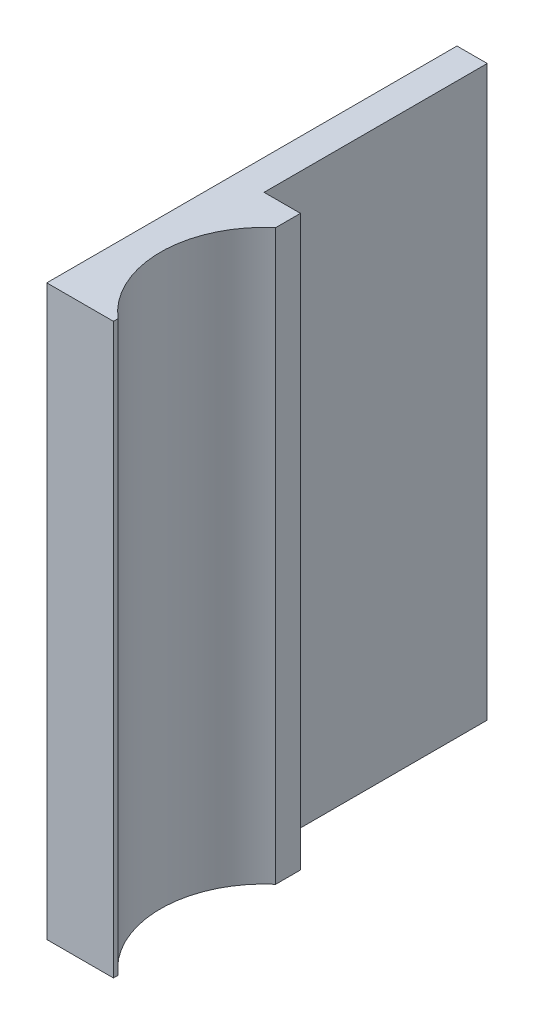
ISO-10303-21;
HEADER;
FILE_DESCRIPTION(('STEP AP214'),'2;1');
FILE_NAME('part.step','',(''),(''),'','','');
FILE_SCHEMA(('AUTOMOTIVE_DESIGN { 1 0 10303 214 1 1 1 1 }'));
ENDSEC;
DATA;
#1=APPLICATION_CONTEXT('core data for automotive mechanical design processes');
#2=APPLICATION_PROTOCOL_DEFINITION('international standard','automotive_design',2000,#1);
#3=PRODUCT_CONTEXT('',#1,'mechanical');
#4=PRODUCT('Part','Part','',(#3));
#5=PRODUCT_RELATED_PRODUCT_CATEGORY('part','',(#4));
#6=PRODUCT_DEFINITION_FORMATION('','',#4);
#7=PRODUCT_DEFINITION_CONTEXT('part definition',#1,'design');
#8=PRODUCT_DEFINITION('design','',#6,#7);
#9=PRODUCT_DEFINITION_SHAPE('','',#8);
#10=(LENGTH_UNIT() NAMED_UNIT(*) SI_UNIT(.MILLI.,.METRE.));
#11=(NAMED_UNIT(*) PLANE_ANGLE_UNIT() SI_UNIT($,.RADIAN.));
#12=(NAMED_UNIT(*) SI_UNIT($,.STERADIAN.) SOLID_ANGLE_UNIT());
#13=UNCERTAINTY_MEASURE_WITH_UNIT(LENGTH_MEASURE(1.E-05),#10,'distance_accuracy_value','');
#14=(GEOMETRIC_REPRESENTATION_CONTEXT(3) GLOBAL_UNCERTAINTY_ASSIGNED_CONTEXT((#13)) GLOBAL_UNIT_ASSIGNED_CONTEXT((#10,
#11,#12)) REPRESENTATION_CONTEXT('',''));
#15=CARTESIAN_POINT('',(0.,0.,0.));
#16=DIRECTION('',(0.,0.,1.));
#17=DIRECTION('',(1.,0.,0.));
#18=AXIS2_PLACEMENT_3D('',#15,#16,#17);
#19=CARTESIAN_POINT('',(-3.49750000000001,59.69,21.5265));
#20=DIRECTION('',(1.,0.,0.));
#21=DIRECTION('',(0.,0.,-1.));
#22=AXIS2_PLACEMENT_3D('',#19,#20,#21);
#23=PLANE('',#22);
#24=DIRECTION('',(0.,0.,1.));
#25=VECTOR('',#24,1.);
#26=CARTESIAN_POINT('',(-3.49750000000001,0.,21.5265));
#27=LINE('',#26,#25);
#28=CARTESIAN_POINT('',(-3.49750000000001,0.,-21.5265));
#29=VERTEX_POINT('',#28);
#30=CARTESIAN_POINT('',(-3.49750000000001,0.,21.5265));
#31=VERTEX_POINT('',#30);
#32=EDGE_CURVE('E129',#29,#31,#27,.T.);
#33=ORIENTED_EDGE('',*,*,#32,.T.);
#34=DIRECTION('',(0.,-1.,0.));
#35=VECTOR('',#34,1.);
#36=CARTESIAN_POINT('',(-3.49750000000001,59.69,21.5265));
#37=LINE('',#36,#35);
#38=CARTESIAN_POINT('',(-3.49750000000001,59.69,21.5265));
#39=VERTEX_POINT('',#38);
#40=EDGE_CURVE('E11',#39,#31,#37,.T.);
#41=ORIENTED_EDGE('',*,*,#40,.F.);
#42=DIRECTION('',(0.,0.,1.));
#43=VECTOR('',#42,1.);
#44=CARTESIAN_POINT('',(-3.49750000000001,59.69,21.5265));
#45=LINE('',#44,#43);
#46=CARTESIAN_POINT('',(-3.49750000000001,59.69,-21.5265));
#47=VERTEX_POINT('',#46);
#48=EDGE_CURVE('E143',#47,#39,#45,.T.);
#49=ORIENTED_EDGE('',*,*,#48,.F.);
#50=DIRECTION('',(0.,-1.,0.));
#51=VECTOR('',#50,1.);
#52=CARTESIAN_POINT('',(-3.49750000000001,59.69,-21.5265));
#53=LINE('',#52,#51);
#54=EDGE_CURVE('E125',#47,#29,#53,.T.);
#55=ORIENTED_EDGE('',*,*,#54,.T.);
#56=EDGE_LOOP('',(#33,#41,#49,#55));
#57=FACE_BOUND('',#56,.T.);
#58=ADVANCED_FACE('F33',(#57),#23,.F.);
#59=CARTESIAN_POINT('',(3.49749999999999,59.69,21.5265));
#60=DIRECTION('',(0.,0.,-1.));
#61=DIRECTION('',(-1.,0.,0.));
#62=AXIS2_PLACEMENT_3D('',#59,#60,#61);
#63=PLANE('',#62);
#64=DIRECTION('',(1.,0.,0.));
#65=VECTOR('',#64,1.);
#66=CARTESIAN_POINT('',(3.49749999999999,0.,21.5265));
#67=LINE('',#66,#65);
#68=CARTESIAN_POINT('',(3.49749999999999,0.,21.5265));
#69=VERTEX_POINT('',#68);
#70=EDGE_CURVE('E132',#31,#69,#67,.T.);
#71=ORIENTED_EDGE('',*,*,#70,.T.);
#72=DIRECTION('',(0.,-1.,0.));
#73=VECTOR('',#72,1.);
#74=CARTESIAN_POINT('',(3.49749999999999,59.69,21.5265));
#75=LINE('',#74,#73);
#76=CARTESIAN_POINT('',(3.49749999999999,59.69,21.5265));
#77=VERTEX_POINT('',#76);
#78=EDGE_CURVE('E41',#77,#69,#75,.T.);
#79=ORIENTED_EDGE('',*,*,#78,.F.);
#80=DIRECTION('',(1.,0.,0.));
#81=VECTOR('',#80,1.);
#82=CARTESIAN_POINT('',(3.49749999999999,59.69,21.5265));
#83=LINE('',#82,#81);
#84=EDGE_CURVE('E92',#39,#77,#83,.T.);
#85=ORIENTED_EDGE('',*,*,#84,.F.);
#86=ORIENTED_EDGE('',*,*,#40,.T.);
#87=EDGE_LOOP('',(#71,#79,#85,#86));
#88=FACE_BOUND('',#87,.T.);
#89=ADVANCED_FACE('F178',(#88),#63,.F.);
#90=CARTESIAN_POINT('',(3.49749999999999,59.69,21.5265));
#91=DIRECTION('',(-1.,0.,0.));
#92=DIRECTION('',(0.,0.,1.));
#93=AXIS2_PLACEMENT_3D('',#90,#91,#92);
#94=PLANE('',#93);
#95=DIRECTION('',(0.,0.,-1.));
#96=VECTOR('',#95,1.);
#97=CARTESIAN_POINT('',(3.49749999999999,0.,21.5265));
#98=LINE('',#97,#96);
#99=CARTESIAN_POINT('',(3.49749999999999,0.,21.0392939657651));
#100=VERTEX_POINT('',#99);
#101=EDGE_CURVE('E134',#69,#100,#98,.T.);
#102=ORIENTED_EDGE('',*,*,#101,.T.);
#103=DIRECTION('',(0.,-1.,0.));
#104=VECTOR('',#103,1.);
#105=CARTESIAN_POINT('',(3.49749999999999,59.69,21.0392939657651));
#106=LINE('',#105,#104);
#107=CARTESIAN_POINT('',(3.49749999999999,59.69,21.0392939657651));
#108=VERTEX_POINT('',#107);
#109=EDGE_CURVE('E150',#108,#100,#106,.T.);
#110=ORIENTED_EDGE('',*,*,#109,.F.);
#111=DIRECTION('',(0.,0.,-1.));
#112=VECTOR('',#111,1.);
#113=CARTESIAN_POINT('',(3.49749999999999,59.69,21.5265));
#114=LINE('',#113,#112);
#115=EDGE_CURVE('E158',#77,#108,#114,.T.);
#116=ORIENTED_EDGE('',*,*,#115,.F.);
#117=ORIENTED_EDGE('',*,*,#78,.T.);
#118=EDGE_LOOP('',(#102,#110,#116,#117));
#119=FACE_BOUND('',#118,.T.);
#120=ADVANCED_FACE('F156',(#119),#94,.F.);
#121=CARTESIAN_POINT('',(10.5455,59.69,12.7665));
#122=DIRECTION('',(0.,-1.,0.));
#123=DIRECTION('',(0.,0.,-1.));
#124=AXIS2_PLACEMENT_3D('',#121,#122,#123);
#125=CYLINDRICAL_SURFACE('',#124,10.868);
#126=CARTESIAN_POINT('',(10.5455,0.,12.7665));
#127=DIRECTION('',(0.,-1.,0.));
#128=DIRECTION('',(0.,0.,1.));
#129=AXIS2_PLACEMENT_3D('',#126,#127,#128);
#130=CIRCLE('',#129,10.868);
#131=CARTESIAN_POINT('',(3.49749999999999,0.,4.49370603423485));
#132=VERTEX_POINT('',#131);
#133=EDGE_CURVE('E136',#100,#132,#130,.T.);
#134=ORIENTED_EDGE('',*,*,#133,.T.);
#135=DIRECTION('',(0.,-1.,0.));
#136=VECTOR('',#135,1.);
#137=CARTESIAN_POINT('',(3.49749999999999,59.69,4.49370603423485));
#138=LINE('',#137,#136);
#139=CARTESIAN_POINT('',(3.49749999999999,59.69,4.49370603423485));
#140=VERTEX_POINT('',#139);
#141=EDGE_CURVE('E147',#140,#132,#138,.T.);
#142=ORIENTED_EDGE('',*,*,#141,.F.);
#143=CARTESIAN_POINT('',(10.5455,59.69,12.7665));
#144=DIRECTION('',(0.,-1.,0.));
#145=DIRECTION('',(0.,0.,1.));
#146=AXIS2_PLACEMENT_3D('',#143,#144,#145);
#147=CIRCLE('',#146,10.868);
#148=EDGE_CURVE('E170',#108,#140,#147,.T.);
#149=ORIENTED_EDGE('',*,*,#148,.F.);
#150=ORIENTED_EDGE('',*,*,#109,.T.);
#151=EDGE_LOOP('',(#134,#142,#149,#150));
#152=FACE_BOUND('',#151,.T.);
#153=ADVANCED_FACE('F166',(#152),#125,.F.);
#154=CARTESIAN_POINT('',(3.49749999999999,59.69,4.49370603423485));
#155=DIRECTION('',(-1.,0.,0.));
#156=DIRECTION('',(0.,0.,1.));
#157=AXIS2_PLACEMENT_3D('',#154,#155,#156);
#158=PLANE('',#157);
#159=DIRECTION('',(0.,0.,-1.));
#160=VECTOR('',#159,1.);
#161=CARTESIAN_POINT('',(3.49749999999999,0.,4.49370603423485));
#162=LINE('',#161,#160);
#163=CARTESIAN_POINT('',(3.49749999999999,0.,1.89849999999999));
#164=VERTEX_POINT('',#163);
#165=EDGE_CURVE('E138',#132,#164,#162,.T.);
#166=ORIENTED_EDGE('',*,*,#165,.T.);
#167=DIRECTION('',(0.,-1.,0.));
#168=VECTOR('',#167,1.);
#169=CARTESIAN_POINT('',(3.49749999999999,59.69,1.89849999999999));
#170=LINE('',#169,#168);
#171=CARTESIAN_POINT('',(3.49749999999999,59.69,1.89849999999999));
#172=VERTEX_POINT('',#171);
#173=EDGE_CURVE('E120',#172,#164,#170,.T.);
#174=ORIENTED_EDGE('',*,*,#173,.F.);
#175=DIRECTION('',(0.,0.,-1.));
#176=VECTOR('',#175,1.);
#177=CARTESIAN_POINT('',(3.49749999999999,59.69,4.49370603423485));
#178=LINE('',#177,#176);
#179=EDGE_CURVE('E111',#140,#172,#178,.T.);
#180=ORIENTED_EDGE('',*,*,#179,.F.);
#181=ORIENTED_EDGE('',*,*,#141,.T.);
#182=EDGE_LOOP('',(#166,#174,#180,#181));
#183=FACE_BOUND('',#182,.T.);
#184=ADVANCED_FACE('F169',(#183),#158,.F.);
#185=CARTESIAN_POINT('',(3.49749999999999,59.69,1.89849999999999));
#186=DIRECTION('',(0.,0.,1.));
#187=DIRECTION('',(1.,0.,0.));
#188=AXIS2_PLACEMENT_3D('',#185,#186,#187);
#189=PLANE('',#188);
#190=DIRECTION('',(-1.,0.,0.));
#191=VECTOR('',#190,1.);
#192=CARTESIAN_POINT('',(3.49749999999999,0.,1.89849999999999));
#193=LINE('',#192,#191);
#194=CARTESIAN_POINT('',(-0.32250000000001,0.,1.89849999999999));
#195=VERTEX_POINT('',#194);
#196=EDGE_CURVE('E119',#164,#195,#193,.T.);
#197=ORIENTED_EDGE('',*,*,#196,.T.);
#198=DIRECTION('',(0.,-1.,0.));
#199=VECTOR('',#198,1.);
#200=CARTESIAN_POINT('',(-0.32250000000001,59.69,1.89849999999999));
#201=LINE('',#200,#199);
#202=CARTESIAN_POINT('',(-0.32250000000001,59.69,1.89849999999999));
#203=VERTEX_POINT('',#202);
#204=EDGE_CURVE('E116',#203,#195,#201,.T.);
#205=ORIENTED_EDGE('',*,*,#204,.F.);
#206=DIRECTION('',(-1.,0.,0.));
#207=VECTOR('',#206,1.);
#208=CARTESIAN_POINT('',(3.49749999999999,59.69,1.89849999999999));
#209=LINE('',#208,#207);
#210=EDGE_CURVE('E105',#172,#203,#209,.T.);
#211=ORIENTED_EDGE('',*,*,#210,.F.);
#212=ORIENTED_EDGE('',*,*,#173,.T.);
#213=EDGE_LOOP('',(#197,#205,#211,#212));
#214=FACE_BOUND('',#213,.T.);
#215=ADVANCED_FACE('F117',(#214),#189,.F.);
#216=CARTESIAN_POINT('',(-0.322500000000013,59.69,-21.5265));
#217=DIRECTION('',(-1.,0.,0.));
#218=DIRECTION('',(0.,0.,1.));
#219=AXIS2_PLACEMENT_3D('',#216,#217,#218);
#220=PLANE('',#219);
#221=DIRECTION('',(0.,0.,-1.));
#222=VECTOR('',#221,1.);
#223=CARTESIAN_POINT('',(-0.322500000000013,0.,-21.5265));
#224=LINE('',#223,#222);
#225=CARTESIAN_POINT('',(-0.322500000000013,0.,-21.5265));
#226=VERTEX_POINT('',#225);
#227=EDGE_CURVE('E78',#195,#226,#224,.T.);
#228=ORIENTED_EDGE('',*,*,#227,.T.);
#229=DIRECTION('',(0.,-1.,0.));
#230=VECTOR('',#229,1.);
#231=CARTESIAN_POINT('',(-0.322500000000013,59.69,-21.5265));
#232=LINE('',#231,#230);
#233=CARTESIAN_POINT('',(-0.322500000000013,59.69,-21.5265));
#234=VERTEX_POINT('',#233);
#235=EDGE_CURVE('E121',#234,#226,#232,.T.);
#236=ORIENTED_EDGE('',*,*,#235,.F.);
#237=DIRECTION('',(0.,0.,-1.));
#238=VECTOR('',#237,1.);
#239=CARTESIAN_POINT('',(-0.322500000000013,59.69,-21.5265));
#240=LINE('',#239,#238);
#241=EDGE_CURVE('E109',#203,#234,#240,.T.);
#242=ORIENTED_EDGE('',*,*,#241,.F.);
#243=ORIENTED_EDGE('',*,*,#204,.T.);
#244=EDGE_LOOP('',(#228,#236,#242,#243));
#245=FACE_BOUND('',#244,.T.);
#246=ADVANCED_FACE('F123',(#245),#220,.F.);
#247=CARTESIAN_POINT('',(-0.322500000000013,59.69,-21.5265));
#248=DIRECTION('',(0.,0.,1.));
#249=DIRECTION('',(1.,0.,0.));
#250=AXIS2_PLACEMENT_3D('',#247,#248,#249);
#251=PLANE('',#250);
#252=DIRECTION('',(-1.,0.,0.));
#253=VECTOR('',#252,1.);
#254=CARTESIAN_POINT('',(-0.322500000000013,0.,-21.5265));
#255=LINE('',#254,#253);
#256=EDGE_CURVE('E84',#226,#29,#255,.T.);
#257=ORIENTED_EDGE('',*,*,#256,.T.);
#258=ORIENTED_EDGE('',*,*,#54,.F.);
#259=DIRECTION('',(-1.,0.,0.));
#260=VECTOR('',#259,1.);
#261=CARTESIAN_POINT('',(-0.322500000000013,59.69,-21.5265));
#262=LINE('',#261,#260);
#263=EDGE_CURVE('E49',#234,#47,#262,.T.);
#264=ORIENTED_EDGE('',*,*,#263,.F.);
#265=ORIENTED_EDGE('',*,*,#235,.T.);
#266=EDGE_LOOP('',(#257,#258,#264,#265));
#267=FACE_BOUND('',#266,.T.);
#268=ADVANCED_FACE('F194',(#267),#251,.F.);
#269=CARTESIAN_POINT('',(10.5455,59.69,12.7665));
#270=DIRECTION('',(0.,1.,0.));
#271=DIRECTION('',(0.,0.,1.));
#272=AXIS2_PLACEMENT_3D('',#269,#270,#271);
#273=PLANE('',#272);
#274=ORIENTED_EDGE('',*,*,#48,.T.);
#275=ORIENTED_EDGE('',*,*,#84,.T.);
#276=ORIENTED_EDGE('',*,*,#115,.T.);
#277=ORIENTED_EDGE('',*,*,#148,.T.);
#278=ORIENTED_EDGE('',*,*,#179,.T.);
#279=ORIENTED_EDGE('',*,*,#210,.T.);
#280=ORIENTED_EDGE('',*,*,#241,.T.);
#281=ORIENTED_EDGE('',*,*,#263,.T.);
#282=EDGE_LOOP('',(#274,#275,#276,#277,#278,#279,#280,#281));
#283=FACE_BOUND('',#282,.T.);
#284=ADVANCED_FACE('F107',(#283),#273,.T.);
#285=CARTESIAN_POINT('',(10.5455,0.,12.7665));
#286=DIRECTION('',(0.,1.,0.));
#287=DIRECTION('',(0.,0.,1.));
#288=AXIS2_PLACEMENT_3D('',#285,#286,#287);
#289=PLANE('',#288);
#290=ORIENTED_EDGE('',*,*,#32,.F.);
#291=ORIENTED_EDGE('',*,*,#256,.F.);
#292=ORIENTED_EDGE('',*,*,#227,.F.);
#293=ORIENTED_EDGE('',*,*,#196,.F.);
#294=ORIENTED_EDGE('',*,*,#165,.F.);
#295=ORIENTED_EDGE('',*,*,#133,.F.);
#296=ORIENTED_EDGE('',*,*,#101,.F.);
#297=ORIENTED_EDGE('',*,*,#70,.F.);
#298=EDGE_LOOP('',(#290,#291,#292,#293,#294,#295,#296,#297));
#299=FACE_BOUND('',#298,.T.);
#300=ADVANCED_FACE('F162',(#299),#289,.F.);
#301=CLOSED_SHELL('',(#58,#89,#120,#153,#184,#215,#246,#268,#284,#300));
#302=MANIFOLD_SOLID_BREP('B2',#301);
#303=ADVANCED_BREP_SHAPE_REPRESENTATION('',(#18,#302),#14);
#304=SHAPE_DEFINITION_REPRESENTATION(#9,#303);
ENDSEC;
END-ISO-10303-21;
